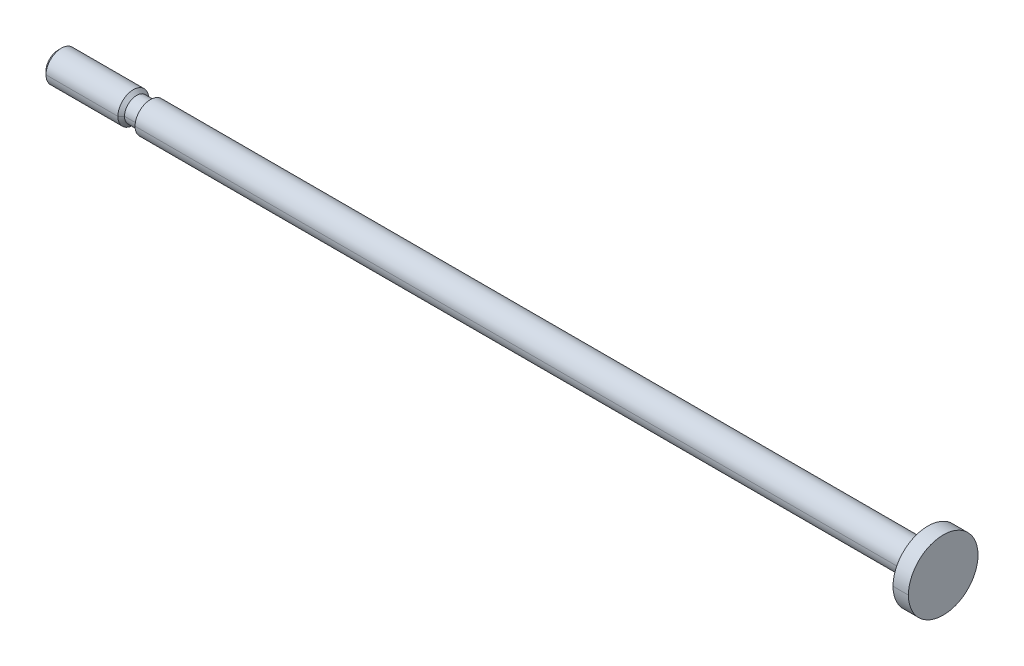
ISO-10303-21;
HEADER;
FILE_DESCRIPTION(('STEP AP214'),'2;1');
FILE_NAME('part.step','',(''),(''),'','','');
FILE_SCHEMA(('AUTOMOTIVE_DESIGN { 1 0 10303 214 1 1 1 1 }'));
ENDSEC;
DATA;
#1=APPLICATION_CONTEXT('core data for automotive mechanical design processes');
#2=APPLICATION_PROTOCOL_DEFINITION('international standard','automotive_design',2000,#1);
#3=PRODUCT_CONTEXT('',#1,'mechanical');
#4=PRODUCT('Part','Part','',(#3));
#5=PRODUCT_RELATED_PRODUCT_CATEGORY('part','',(#4));
#6=PRODUCT_DEFINITION_FORMATION('','',#4);
#7=PRODUCT_DEFINITION_CONTEXT('part definition',#1,'design');
#8=PRODUCT_DEFINITION('design','',#6,#7);
#9=PRODUCT_DEFINITION_SHAPE('','',#8);
#10=(LENGTH_UNIT() NAMED_UNIT(*) SI_UNIT(.MILLI.,.METRE.));
#11=(NAMED_UNIT(*) PLANE_ANGLE_UNIT() SI_UNIT($,.RADIAN.));
#12=(NAMED_UNIT(*) SI_UNIT($,.STERADIAN.) SOLID_ANGLE_UNIT());
#13=UNCERTAINTY_MEASURE_WITH_UNIT(LENGTH_MEASURE(1.E-05),#10,'distance_accuracy_value','');
#14=(GEOMETRIC_REPRESENTATION_CONTEXT(3) GLOBAL_UNCERTAINTY_ASSIGNED_CONTEXT((#13)) GLOBAL_UNIT_ASSIGNED_CONTEXT((#10,
#11,#12)) REPRESENTATION_CONTEXT('',''));
#15=CARTESIAN_POINT('',(0.,0.,0.));
#16=DIRECTION('',(0.,0.,1.));
#17=DIRECTION('',(1.,0.,0.));
#18=AXIS2_PLACEMENT_3D('',#15,#16,#17);
#19=CARTESIAN_POINT('',(87.,0.,0.));
#20=DIRECTION('',(-1.,0.,0.));
#21=DIRECTION('',(0.,-1.,0.));
#22=AXIS2_PLACEMENT_3D('',#19,#20,#21);
#23=CYLINDRICAL_SURFACE('',#22,4.52);
#24=CARTESIAN_POINT('',(87.,0.,0.));
#25=DIRECTION('',(1.,0.,0.));
#26=DIRECTION('',(0.,0.,-1.));
#27=AXIS2_PLACEMENT_3D('',#24,#25,#26);
#28=CIRCLE('',#27,4.52);
#29=CARTESIAN_POINT('',(87.,0.,-4.52));
#30=VERTEX_POINT('',#29);
#31=CARTESIAN_POINT('',(87.,0.,4.52));
#32=VERTEX_POINT('',#31);
#33=EDGE_CURVE('E11',#30,#32,#28,.T.);
#34=ORIENTED_EDGE('',*,*,#33,.F.);
#35=DIRECTION('',(-1.,0.,0.));
#36=VECTOR('',#35,1.);
#37=CARTESIAN_POINT('',(87.,0.,-4.52));
#38=LINE('',#37,#36);
#39=CARTESIAN_POINT('',(85.,0.,-4.52));
#40=VERTEX_POINT('',#39);
#41=EDGE_CURVE('E25',#30,#40,#38,.T.);
#42=ORIENTED_EDGE('',*,*,#41,.T.);
#43=CARTESIAN_POINT('',(85.,0.,0.));
#44=DIRECTION('',(1.,0.,0.));
#45=DIRECTION('',(0.,0.,-1.));
#46=AXIS2_PLACEMENT_3D('',#43,#44,#45);
#47=CIRCLE('',#46,4.52);
#48=CARTESIAN_POINT('',(85.,0.,4.52));
#49=VERTEX_POINT('',#48);
#50=EDGE_CURVE('E211',#40,#49,#47,.T.);
#51=ORIENTED_EDGE('',*,*,#50,.T.);
#52=DIRECTION('',(-1.,0.,0.));
#53=VECTOR('',#52,1.);
#54=CARTESIAN_POINT('',(87.,0.,4.52));
#55=LINE('',#54,#53);
#56=EDGE_CURVE('E206',#32,#49,#55,.T.);
#57=ORIENTED_EDGE('',*,*,#56,.F.);
#58=EDGE_LOOP('',(#34,#42,#51,#57));
#59=FACE_BOUND('',#58,.T.);
#60=ADVANCED_FACE('F17',(#59),#23,.T.);
#61=CARTESIAN_POINT('',(87.,0.,0.));
#62=DIRECTION('',(-1.,0.,0.));
#63=DIRECTION('',(0.,1.,0.));
#64=AXIS2_PLACEMENT_3D('',#61,#62,#63);
#65=CYLINDRICAL_SURFACE('',#64,4.52);
#66=CARTESIAN_POINT('',(85.,0.,0.));
#67=DIRECTION('',(1.,0.,0.));
#68=DIRECTION('',(0.,0.,-1.));
#69=AXIS2_PLACEMENT_3D('',#66,#67,#68);
#70=CIRCLE('',#69,4.52);
#71=EDGE_CURVE('E202',#49,#40,#70,.T.);
#72=ORIENTED_EDGE('',*,*,#71,.T.);
#73=ORIENTED_EDGE('',*,*,#41,.F.);
#74=CARTESIAN_POINT('',(87.,0.,0.));
#75=DIRECTION('',(1.,0.,0.));
#76=DIRECTION('',(0.,0.,-1.));
#77=AXIS2_PLACEMENT_3D('',#74,#75,#76);
#78=CIRCLE('',#77,4.52);
#79=EDGE_CURVE('E197',#32,#30,#78,.T.);
#80=ORIENTED_EDGE('',*,*,#79,.F.);
#81=ORIENTED_EDGE('',*,*,#56,.T.);
#82=EDGE_LOOP('',(#72,#73,#80,#81));
#83=FACE_BOUND('',#82,.T.);
#84=ADVANCED_FACE('F224',(#83),#65,.T.);
#85=CARTESIAN_POINT('',(87.,4.52,0.));
#86=DIRECTION('',(-1.,0.,0.));
#87=DIRECTION('',(0.,0.,1.));
#88=AXIS2_PLACEMENT_3D('',#85,#86,#87);
#89=PLANE('',#88);
#90=ORIENTED_EDGE('',*,*,#33,.T.);
#91=ORIENTED_EDGE('',*,*,#79,.T.);
#92=EDGE_LOOP('',(#90,#91));
#93=FACE_BOUND('',#92,.T.);
#94=ADVANCED_FACE('F229',(#93),#89,.F.);
#95=CARTESIAN_POINT('',(85.,2.,0.));
#96=DIRECTION('',(1.,0.,0.));
#97=DIRECTION('',(0.,0.,-1.));
#98=AXIS2_PLACEMENT_3D('',#95,#96,#97);
#99=PLANE('',#98);
#100=ORIENTED_EDGE('',*,*,#50,.F.);
#101=ORIENTED_EDGE('',*,*,#71,.F.);
#102=EDGE_LOOP('',(#100,#101));
#103=FACE_BOUND('',#102,.T.);
#104=CARTESIAN_POINT('',(85.,0.,0.));
#105=DIRECTION('',(1.,0.,0.));
#106=DIRECTION('',(0.,0.,-1.));
#107=AXIS2_PLACEMENT_3D('',#104,#105,#106);
#108=CIRCLE('',#107,2.);
#109=CARTESIAN_POINT('',(85.,0.,-2.));
#110=VERTEX_POINT('',#109);
#111=CARTESIAN_POINT('',(85.,0.,2.));
#112=VERTEX_POINT('',#111);
#113=EDGE_CURVE('E193',#110,#112,#108,.T.);
#114=ORIENTED_EDGE('',*,*,#113,.T.);
#115=CARTESIAN_POINT('',(85.,0.,0.));
#116=DIRECTION('',(1.,0.,0.));
#117=DIRECTION('',(0.,0.,-1.));
#118=AXIS2_PLACEMENT_3D('',#115,#116,#117);
#119=CIRCLE('',#118,2.);
#120=EDGE_CURVE('E189',#112,#110,#119,.T.);
#121=ORIENTED_EDGE('',*,*,#120,.T.);
#122=EDGE_LOOP('',(#114,#121));
#123=FACE_BOUND('',#122,.T.);
#124=ADVANCED_FACE('F225',(#103,#123),#99,.F.);
#125=CARTESIAN_POINT('',(87.,0.,0.));
#126=DIRECTION('',(-1.,0.,0.));
#127=DIRECTION('',(0.,1.,0.));
#128=AXIS2_PLACEMENT_3D('',#125,#126,#127);
#129=CYLINDRICAL_SURFACE('',#128,2.);
#130=CARTESIAN_POINT('',(-16.,0.,0.));
#131=DIRECTION('',(1.,0.,0.));
#132=DIRECTION('',(0.,0.,-1.));
#133=AXIS2_PLACEMENT_3D('',#130,#131,#132);
#134=CIRCLE('',#133,2.);
#135=CARTESIAN_POINT('',(-16.,0.,2.));
#136=VERTEX_POINT('',#135);
#137=CARTESIAN_POINT('',(-16.,0.,-2.));
#138=VERTEX_POINT('',#137);
#139=EDGE_CURVE('E185',#136,#138,#134,.T.);
#140=ORIENTED_EDGE('',*,*,#139,.T.);
#141=DIRECTION('',(-1.,0.,0.));
#142=VECTOR('',#141,1.);
#143=CARTESIAN_POINT('',(85.,0.,-2.));
#144=LINE('',#143,#142);
#145=EDGE_CURVE('E180',#110,#138,#144,.T.);
#146=ORIENTED_EDGE('',*,*,#145,.F.);
#147=ORIENTED_EDGE('',*,*,#120,.F.);
#148=DIRECTION('',(-1.,0.,0.));
#149=VECTOR('',#148,1.);
#150=CARTESIAN_POINT('',(85.,0.,2.));
#151=LINE('',#150,#149);
#152=EDGE_CURVE('E176',#112,#136,#151,.T.);
#153=ORIENTED_EDGE('',*,*,#152,.T.);
#154=EDGE_LOOP('',(#140,#146,#147,#153));
#155=FACE_BOUND('',#154,.T.);
#156=ADVANCED_FACE('F228',(#155),#129,.T.);
#157=CARTESIAN_POINT('',(87.,0.,0.));
#158=DIRECTION('',(-1.,0.,0.));
#159=DIRECTION('',(0.,-1.,0.));
#160=AXIS2_PLACEMENT_3D('',#157,#158,#159);
#161=CYLINDRICAL_SURFACE('',#160,2.);
#162=ORIENTED_EDGE('',*,*,#113,.F.);
#163=ORIENTED_EDGE('',*,*,#145,.T.);
#164=CARTESIAN_POINT('',(-16.,0.,0.));
#165=DIRECTION('',(1.,0.,0.));
#166=DIRECTION('',(0.,0.,-1.));
#167=AXIS2_PLACEMENT_3D('',#164,#165,#166);
#168=CIRCLE('',#167,2.);
#169=EDGE_CURVE('E171',#138,#136,#168,.T.);
#170=ORIENTED_EDGE('',*,*,#169,.T.);
#171=ORIENTED_EDGE('',*,*,#152,.F.);
#172=EDGE_LOOP('',(#162,#163,#170,#171));
#173=FACE_BOUND('',#172,.T.);
#174=ADVANCED_FACE('F237',(#173),#161,.T.);
#175=CARTESIAN_POINT('',(-16.,1.5705,0.));
#176=DIRECTION('',(1.,0.,0.));
#177=DIRECTION('',(0.,0.,-1.));
#178=AXIS2_PLACEMENT_3D('',#175,#176,#177);
#179=PLANE('',#178);
#180=ORIENTED_EDGE('',*,*,#169,.F.);
#181=ORIENTED_EDGE('',*,*,#139,.F.);
#182=EDGE_LOOP('',(#180,#181));
#183=FACE_BOUND('',#182,.T.);
#184=CARTESIAN_POINT('',(-16.,0.,0.));
#185=DIRECTION('',(1.,0.,0.));
#186=DIRECTION('',(0.,0.,-1.));
#187=AXIS2_PLACEMENT_3D('',#184,#185,#186);
#188=CIRCLE('',#187,1.5705);
#189=CARTESIAN_POINT('',(-16.,0.,-1.5705));
#190=VERTEX_POINT('',#189);
#191=CARTESIAN_POINT('',(-16.,0.,1.5705));
#192=VERTEX_POINT('',#191);
#193=EDGE_CURVE('E167',#190,#192,#188,.T.);
#194=ORIENTED_EDGE('',*,*,#193,.T.);
#195=CARTESIAN_POINT('',(-16.,0.,0.));
#196=DIRECTION('',(1.,0.,0.));
#197=DIRECTION('',(0.,0.,-1.));
#198=AXIS2_PLACEMENT_3D('',#195,#196,#197);
#199=CIRCLE('',#198,1.5705);
#200=EDGE_CURVE('E163',#192,#190,#199,.T.);
#201=ORIENTED_EDGE('',*,*,#200,.T.);
#202=EDGE_LOOP('',(#194,#201));
#203=FACE_BOUND('',#202,.T.);
#204=ADVANCED_FACE('F241',(#183,#203),#179,.F.);
#205=CARTESIAN_POINT('',(87.,0.,0.));
#206=DIRECTION('',(-1.,0.,0.));
#207=DIRECTION('',(0.,1.,0.));
#208=AXIS2_PLACEMENT_3D('',#205,#206,#207);
#209=CYLINDRICAL_SURFACE('',#208,1.5705);
#210=CARTESIAN_POINT('',(-17.8,0.,0.));
#211=DIRECTION('',(1.,0.,0.));
#212=DIRECTION('',(0.,0.,-1.));
#213=AXIS2_PLACEMENT_3D('',#210,#211,#212);
#214=CIRCLE('',#213,1.5705);
#215=CARTESIAN_POINT('',(-17.8,0.,1.5705));
#216=VERTEX_POINT('',#215);
#217=CARTESIAN_POINT('',(-17.8,0.,-1.5705));
#218=VERTEX_POINT('',#217);
#219=EDGE_CURVE('E159',#216,#218,#214,.T.);
#220=ORIENTED_EDGE('',*,*,#219,.T.);
#221=DIRECTION('',(-1.,0.,0.));
#222=VECTOR('',#221,1.);
#223=CARTESIAN_POINT('',(-16.,0.,-1.5705));
#224=LINE('',#223,#222);
#225=EDGE_CURVE('E154',#190,#218,#224,.T.);
#226=ORIENTED_EDGE('',*,*,#225,.F.);
#227=ORIENTED_EDGE('',*,*,#200,.F.);
#228=DIRECTION('',(-1.,0.,0.));
#229=VECTOR('',#228,1.);
#230=CARTESIAN_POINT('',(-16.,0.,1.5705));
#231=LINE('',#230,#229);
#232=EDGE_CURVE('E150',#192,#216,#231,.T.);
#233=ORIENTED_EDGE('',*,*,#232,.T.);
#234=EDGE_LOOP('',(#220,#226,#227,#233));
#235=FACE_BOUND('',#234,.T.);
#236=ADVANCED_FACE('F244',(#235),#209,.T.);
#237=CARTESIAN_POINT('',(87.,0.,0.));
#238=DIRECTION('',(-1.,0.,0.));
#239=DIRECTION('',(0.,-1.,0.));
#240=AXIS2_PLACEMENT_3D('',#237,#238,#239);
#241=CYLINDRICAL_SURFACE('',#240,1.5705);
#242=ORIENTED_EDGE('',*,*,#193,.F.);
#243=ORIENTED_EDGE('',*,*,#225,.T.);
#244=CARTESIAN_POINT('',(-17.8,0.,0.));
#245=DIRECTION('',(1.,0.,0.));
#246=DIRECTION('',(0.,0.,-1.));
#247=AXIS2_PLACEMENT_3D('',#244,#245,#246);
#248=CIRCLE('',#247,1.5705);
#249=EDGE_CURVE('E145',#218,#216,#248,.T.);
#250=ORIENTED_EDGE('',*,*,#249,.T.);
#251=ORIENTED_EDGE('',*,*,#232,.F.);
#252=EDGE_LOOP('',(#242,#243,#250,#251));
#253=FACE_BOUND('',#252,.T.);
#254=ADVANCED_FACE('F252',(#253),#241,.T.);
#255=CARTESIAN_POINT('',(-18.2295,0.,0.));
#256=DIRECTION('',(-1.,0.,0.));
#257=DIRECTION('',(0.,-1.,0.));
#258=AXIS2_PLACEMENT_3D('',#255,#256,#257);
#259=CONICAL_SURFACE('',#258,2.,0.7853981634);
#260=ORIENTED_EDGE('',*,*,#249,.F.);
#261=DIRECTION('',(-0.707106781184742,0.,-0.707106781188353));
#262=VECTOR('',#261,1.);
#263=CARTESIAN_POINT('',(-17.8000000000011,0.,-1.5704999999989));
#264=LINE('',#263,#262);
#265=CARTESIAN_POINT('',(-18.2295,0.,-2.));
#266=VERTEX_POINT('',#265);
#267=EDGE_CURVE('E141',#218,#266,#264,.T.);
#268=ORIENTED_EDGE('',*,*,#267,.T.);
#269=CARTESIAN_POINT('',(-18.2295,0.,0.));
#270=DIRECTION('',(1.,0.,0.));
#271=DIRECTION('',(0.,0.,-1.));
#272=AXIS2_PLACEMENT_3D('',#269,#270,#271);
#273=CIRCLE('',#272,2.);
#274=CARTESIAN_POINT('',(-18.2295,0.,2.));
#275=VERTEX_POINT('',#274);
#276=EDGE_CURVE('E137',#266,#275,#273,.T.);
#277=ORIENTED_EDGE('',*,*,#276,.T.);
#278=DIRECTION('',(-0.707106781184742,0.,0.707106781188353));
#279=VECTOR('',#278,1.);
#280=CARTESIAN_POINT('',(-17.8000000000011,0.,1.5704999999989));
#281=LINE('',#280,#279);
#282=EDGE_CURVE('E132',#216,#275,#281,.T.);
#283=ORIENTED_EDGE('',*,*,#282,.F.);
#284=EDGE_LOOP('',(#260,#268,#277,#283));
#285=FACE_BOUND('',#284,.T.);
#286=ADVANCED_FACE('F258',(#285),#259,.T.);
#287=CARTESIAN_POINT('',(-18.2295,0.,0.));
#288=DIRECTION('',(-1.,0.,0.));
#289=DIRECTION('',(0.,1.,0.));
#290=AXIS2_PLACEMENT_3D('',#287,#288,#289);
#291=CONICAL_SURFACE('',#290,2.,0.7853981634);
#292=CARTESIAN_POINT('',(-18.2295,0.,0.));
#293=DIRECTION('',(1.,0.,0.));
#294=DIRECTION('',(0.,0.,-1.));
#295=AXIS2_PLACEMENT_3D('',#292,#293,#294);
#296=CIRCLE('',#295,2.);
#297=EDGE_CURVE('E127',#275,#266,#296,.T.);
#298=ORIENTED_EDGE('',*,*,#297,.T.);
#299=ORIENTED_EDGE('',*,*,#267,.F.);
#300=ORIENTED_EDGE('',*,*,#219,.F.);
#301=ORIENTED_EDGE('',*,*,#282,.T.);
#302=EDGE_LOOP('',(#298,#299,#300,#301));
#303=FACE_BOUND('',#302,.T.);
#304=ADVANCED_FACE('F262',(#303),#291,.T.);
#305=CARTESIAN_POINT('',(87.,0.,0.));
#306=DIRECTION('',(-1.,0.,0.));
#307=DIRECTION('',(0.,1.,0.));
#308=AXIS2_PLACEMENT_3D('',#305,#306,#307);
#309=CYLINDRICAL_SURFACE('',#308,2.);
#310=CARTESIAN_POINT('',(-27.5705,0.,0.));
#311=DIRECTION('',(1.,0.,0.));
#312=DIRECTION('',(0.,0.,-1.));
#313=AXIS2_PLACEMENT_3D('',#310,#311,#312);
#314=CIRCLE('',#313,2.);
#315=CARTESIAN_POINT('',(-27.5705,0.,2.));
#316=VERTEX_POINT('',#315);
#317=CARTESIAN_POINT('',(-27.5705,0.,-2.));
#318=VERTEX_POINT('',#317);
#319=EDGE_CURVE('E98',#316,#318,#314,.T.);
#320=ORIENTED_EDGE('',*,*,#319,.T.);
#321=DIRECTION('',(-1.,0.,0.));
#322=VECTOR('',#321,1.);
#323=CARTESIAN_POINT('',(-18.2295,0.,-2.));
#324=LINE('',#323,#322);
#325=EDGE_CURVE('E119',#266,#318,#324,.T.);
#326=ORIENTED_EDGE('',*,*,#325,.F.);
#327=ORIENTED_EDGE('',*,*,#297,.F.);
#328=DIRECTION('',(-1.,0.,0.));
#329=VECTOR('',#328,1.);
#330=CARTESIAN_POINT('',(-18.2295,0.,2.));
#331=LINE('',#330,#329);
#332=EDGE_CURVE('E115',#275,#316,#331,.T.);
#333=ORIENTED_EDGE('',*,*,#332,.T.);
#334=EDGE_LOOP('',(#320,#326,#327,#333));
#335=FACE_BOUND('',#334,.T.);
#336=ADVANCED_FACE('F266',(#335),#309,.T.);
#337=CARTESIAN_POINT('',(87.,0.,0.));
#338=DIRECTION('',(-1.,0.,0.));
#339=DIRECTION('',(0.,-1.,0.));
#340=AXIS2_PLACEMENT_3D('',#337,#338,#339);
#341=CYLINDRICAL_SURFACE('',#340,2.);
#342=ORIENTED_EDGE('',*,*,#276,.F.);
#343=ORIENTED_EDGE('',*,*,#325,.T.);
#344=CARTESIAN_POINT('',(-27.5705,0.,0.));
#345=DIRECTION('',(1.,0.,0.));
#346=DIRECTION('',(0.,0.,-1.));
#347=AXIS2_PLACEMENT_3D('',#344,#345,#346);
#348=CIRCLE('',#347,2.);
#349=EDGE_CURVE('E110',#318,#316,#348,.T.);
#350=ORIENTED_EDGE('',*,*,#349,.T.);
#351=ORIENTED_EDGE('',*,*,#332,.F.);
#352=EDGE_LOOP('',(#342,#343,#350,#351));
#353=FACE_BOUND('',#352,.T.);
#354=ADVANCED_FACE('F268',(#353),#341,.T.);
#355=CARTESIAN_POINT('',(-28.,0.,0.));
#356=DIRECTION('',(1.,0.,0.));
#357=DIRECTION('',(0.,-1.,0.));
#358=AXIS2_PLACEMENT_3D('',#355,#356,#357);
#359=CONICAL_SURFACE('',#358,1.5705,0.7853981634);
#360=ORIENTED_EDGE('',*,*,#349,.F.);
#361=DIRECTION('',(0.707106781184742,0.,-0.707106781188353));
#362=VECTOR('',#361,1.);
#363=CARTESIAN_POINT('',(-28.,0.,-1.5705));
#364=LINE('',#363,#362);
#365=CARTESIAN_POINT('',(-28.,0.,-1.5705));
#366=VERTEX_POINT('',#365);
#367=EDGE_CURVE('E90',#366,#318,#364,.T.);
#368=ORIENTED_EDGE('',*,*,#367,.F.);
#369=CARTESIAN_POINT('',(-28.,0.,0.));
#370=DIRECTION('',(1.,0.,0.));
#371=DIRECTION('',(0.,0.,-1.));
#372=AXIS2_PLACEMENT_3D('',#369,#370,#371);
#373=CIRCLE('',#372,1.5705);
#374=CARTESIAN_POINT('',(-28.,0.,1.5705));
#375=VERTEX_POINT('',#374);
#376=EDGE_CURVE('E83',#366,#375,#373,.T.);
#377=ORIENTED_EDGE('',*,*,#376,.T.);
#378=DIRECTION('',(0.707106781184742,0.,0.707106781188353));
#379=VECTOR('',#378,1.);
#380=CARTESIAN_POINT('',(-28.,0.,1.5705));
#381=LINE('',#380,#379);
#382=EDGE_CURVE('E87',#375,#316,#381,.T.);
#383=ORIENTED_EDGE('',*,*,#382,.T.);
#384=EDGE_LOOP('',(#360,#368,#377,#383));
#385=FACE_BOUND('',#384,.T.);
#386=ADVANCED_FACE('F86',(#385),#359,.T.);
#387=CARTESIAN_POINT('',(-28.,0.,0.));
#388=DIRECTION('',(1.,0.,0.));
#389=DIRECTION('',(0.,1.,0.));
#390=AXIS2_PLACEMENT_3D('',#387,#388,#389);
#391=CONICAL_SURFACE('',#390,1.5705,0.7853981634);
#392=CARTESIAN_POINT('',(-28.,0.,0.));
#393=DIRECTION('',(1.,0.,0.));
#394=DIRECTION('',(0.,0.,-1.));
#395=AXIS2_PLACEMENT_3D('',#392,#393,#394);
#396=CIRCLE('',#395,1.5705);
#397=EDGE_CURVE('E97',#375,#366,#396,.T.);
#398=ORIENTED_EDGE('',*,*,#397,.T.);
#399=ORIENTED_EDGE('',*,*,#367,.T.);
#400=ORIENTED_EDGE('',*,*,#319,.F.);
#401=ORIENTED_EDGE('',*,*,#382,.F.);
#402=EDGE_LOOP('',(#398,#399,#400,#401));
#403=FACE_BOUND('',#402,.T.);
#404=ADVANCED_FACE('F96',(#403),#391,.T.);
#405=CARTESIAN_POINT('',(-28.,0.,0.));
#406=DIRECTION('',(1.,0.,0.));
#407=DIRECTION('',(0.,0.,-1.));
#408=AXIS2_PLACEMENT_3D('',#405,#406,#407);
#409=PLANE('',#408);
#410=ORIENTED_EDGE('',*,*,#376,.F.);
#411=ORIENTED_EDGE('',*,*,#397,.F.);
#412=EDGE_LOOP('',(#410,#411));
#413=FACE_BOUND('',#412,.T.);
#414=ADVANCED_FACE('F100',(#413),#409,.F.);
#415=CLOSED_SHELL('',(#60,#84,#94,#124,#156,#174,#204,#236,#254,#286,#304,#336,#354,#386,#404,#414));
#416=MANIFOLD_SOLID_BREP('B1',#415);
#417=ADVANCED_BREP_SHAPE_REPRESENTATION('',(#18,#416),#14);
#418=SHAPE_DEFINITION_REPRESENTATION(#9,#417);
ENDSEC;
END-ISO-10303-21;
